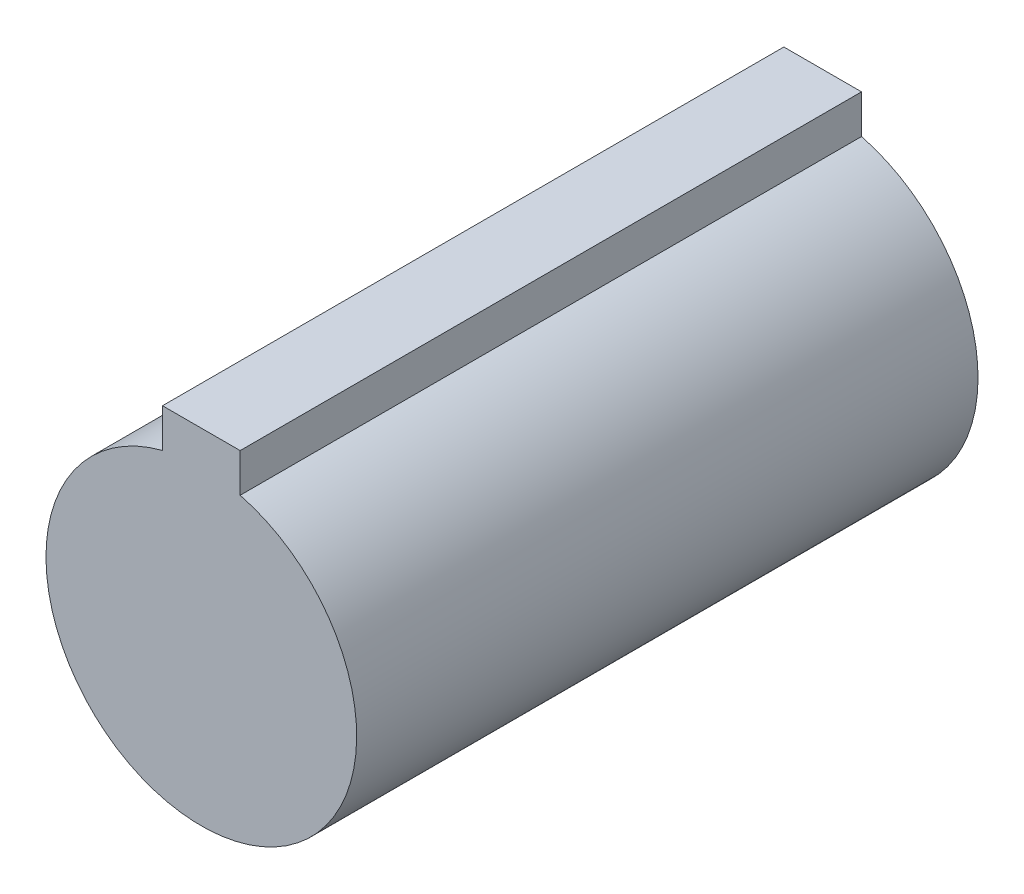
ISO-10303-21;
HEADER;
FILE_DESCRIPTION(('STEP AP214'),'2;1');
FILE_NAME('part.step','',(''),(''),'','','');
FILE_SCHEMA(('AUTOMOTIVE_DESIGN { 1 0 10303 214 1 1 1 1 }'));
ENDSEC;
DATA;
#1=APPLICATION_CONTEXT('core data for automotive mechanical design processes');
#2=APPLICATION_PROTOCOL_DEFINITION('international standard','automotive_design',2000,#1);
#3=PRODUCT_CONTEXT('',#1,'mechanical');
#4=PRODUCT('Part','Part','',(#3));
#5=PRODUCT_RELATED_PRODUCT_CATEGORY('part','',(#4));
#6=PRODUCT_DEFINITION_FORMATION('','',#4);
#7=PRODUCT_DEFINITION_CONTEXT('part definition',#1,'design');
#8=PRODUCT_DEFINITION('design','',#6,#7);
#9=PRODUCT_DEFINITION_SHAPE('','',#8);
#10=(LENGTH_UNIT() NAMED_UNIT(*) SI_UNIT(.MILLI.,.METRE.));
#11=(NAMED_UNIT(*) PLANE_ANGLE_UNIT() SI_UNIT($,.RADIAN.));
#12=(NAMED_UNIT(*) SI_UNIT($,.STERADIAN.) SOLID_ANGLE_UNIT());
#13=UNCERTAINTY_MEASURE_WITH_UNIT(LENGTH_MEASURE(1.E-05),#10,'distance_accuracy_value','');
#14=(GEOMETRIC_REPRESENTATION_CONTEXT(3) GLOBAL_UNCERTAINTY_ASSIGNED_CONTEXT((#13)) GLOBAL_UNIT_ASSIGNED_CONTEXT((#10,
#11,#12)) REPRESENTATION_CONTEXT('',''));
#15=CARTESIAN_POINT('',(0.,0.,0.));
#16=DIRECTION('',(0.,0.,1.));
#17=DIRECTION('',(1.,0.,0.));
#18=AXIS2_PLACEMENT_3D('',#15,#16,#17);
#19=CARTESIAN_POINT('',(-1.80595046373357,2.53165746535202,50.8));
#20=DIRECTION('',(0.,0.,-1.));
#21=DIRECTION('',(-1.,0.,0.));
#22=AXIS2_PLACEMENT_3D('',#19,#20,#21);
#23=CYLINDRICAL_SURFACE('',#22,6.35);
#24=CARTESIAN_POINT('',(-1.80595046373357,2.53165746535202,25.4));
#25=DIRECTION('',(0.,0.,1.));
#26=DIRECTION('',(1.,0.,0.));
#27=AXIS2_PLACEMENT_3D('',#24,#25,#26);
#28=CIRCLE('',#27,6.35);
#29=CARTESIAN_POINT('',(-3.39345046373357,8.68001852745629,25.4));
#30=VERTEX_POINT('',#29);
#31=CARTESIAN_POINT('',(-0.218450463733567,8.68001852745629,25.4));
#32=VERTEX_POINT('',#31);
#33=EDGE_CURVE('E110',#30,#32,#28,.T.);
#34=ORIENTED_EDGE('',*,*,#33,.T.);
#35=DIRECTION('',(0.,0.,-1.));
#36=VECTOR('',#35,1.);
#37=CARTESIAN_POINT('',(-0.218450463733567,8.68001852745629,50.8));
#38=LINE('',#37,#36);
#39=CARTESIAN_POINT('',(-0.218450463733567,8.68001852745629,50.8));
#40=VERTEX_POINT('',#39);
#41=EDGE_CURVE('E70',#40,#32,#38,.T.);
#42=ORIENTED_EDGE('',*,*,#41,.F.);
#43=CARTESIAN_POINT('',(-1.80595046373357,2.53165746535202,50.8));
#44=DIRECTION('',(0.,0.,1.));
#45=DIRECTION('',(1.,0.,0.));
#46=AXIS2_PLACEMENT_3D('',#43,#44,#45);
#47=CIRCLE('',#46,6.35);
#48=CARTESIAN_POINT('',(-3.39345046373357,8.68001852745629,50.8));
#49=VERTEX_POINT('',#48);
#50=EDGE_CURVE('E127',#49,#40,#47,.T.);
#51=ORIENTED_EDGE('',*,*,#50,.F.);
#52=DIRECTION('',(0.,0.,-1.));
#53=VECTOR('',#52,1.);
#54=CARTESIAN_POINT('',(-3.39345046373357,8.68001852745629,50.8));
#55=LINE('',#54,#53);
#56=EDGE_CURVE('E12',#49,#30,#55,.T.);
#57=ORIENTED_EDGE('',*,*,#56,.T.);
#58=EDGE_LOOP('',(#34,#42,#51,#57));
#59=FACE_BOUND('',#58,.T.);
#60=ADVANCED_FACE('F60',(#59),#23,.T.);
#61=CARTESIAN_POINT('',(0.,0.,25.4));
#62=DIRECTION('',(0.,0.,1.));
#63=DIRECTION('',(1.,0.,0.));
#64=AXIS2_PLACEMENT_3D('',#61,#62,#63);
#65=PLANE('',#64);
#66=ORIENTED_EDGE('',*,*,#33,.F.);
#67=DIRECTION('',(0.,-1.,0.));
#68=VECTOR('',#67,1.);
#69=CARTESIAN_POINT('',(-3.39345046373357,10.2631935622144,25.4));
#70=LINE('',#69,#68);
#71=CARTESIAN_POINT('',(-3.39345046373357,10.2631935622144,25.4));
#72=VERTEX_POINT('',#71);
#73=EDGE_CURVE('E105',#72,#30,#70,.T.);
#74=ORIENTED_EDGE('',*,*,#73,.F.);
#75=DIRECTION('',(1.,0.,0.));
#76=VECTOR('',#75,1.);
#77=CARTESIAN_POINT('',(-3.39345046373357,10.2631935622144,25.4));
#78=LINE('',#77,#76);
#79=CARTESIAN_POINT('',(-0.218450463733567,10.2631935622144,25.4));
#80=VERTEX_POINT('',#79);
#81=EDGE_CURVE('E115',#72,#80,#78,.T.);
#82=ORIENTED_EDGE('',*,*,#81,.T.);
#83=DIRECTION('',(0.,-1.,0.));
#84=VECTOR('',#83,1.);
#85=CARTESIAN_POINT('',(-0.218450463733567,10.2631935622144,25.4));
#86=LINE('',#85,#84);
#87=EDGE_CURVE('E117',#80,#32,#86,.T.);
#88=ORIENTED_EDGE('',*,*,#87,.T.);
#89=EDGE_LOOP('',(#66,#74,#82,#88));
#90=FACE_BOUND('',#89,.T.);
#91=ADVANCED_FACE('F113',(#90),#65,.F.);
#92=CARTESIAN_POINT('',(0.,0.,50.8));
#93=DIRECTION('',(0.,0.,1.));
#94=DIRECTION('',(1.,0.,0.));
#95=AXIS2_PLACEMENT_3D('',#92,#93,#94);
#96=PLANE('',#95);
#97=DIRECTION('',(0.,-1.,0.));
#98=VECTOR('',#97,1.);
#99=CARTESIAN_POINT('',(-3.39345046373357,10.2631935622144,50.8));
#100=LINE('',#99,#98);
#101=CARTESIAN_POINT('',(-3.39345046373357,10.2631935622144,50.8));
#102=VERTEX_POINT('',#101);
#103=EDGE_CURVE('E108',#102,#49,#100,.T.);
#104=ORIENTED_EDGE('',*,*,#103,.T.);
#105=ORIENTED_EDGE('',*,*,#50,.T.);
#106=DIRECTION('',(0.,-1.,0.));
#107=VECTOR('',#106,1.);
#108=CARTESIAN_POINT('',(-0.218450463733567,10.2631935622144,50.8));
#109=LINE('',#108,#107);
#110=CARTESIAN_POINT('',(-0.218450463733567,10.2631935622144,50.8));
#111=VERTEX_POINT('',#110);
#112=EDGE_CURVE('E123',#111,#40,#109,.T.);
#113=ORIENTED_EDGE('',*,*,#112,.F.);
#114=DIRECTION('',(1.,0.,0.));
#115=VECTOR('',#114,1.);
#116=CARTESIAN_POINT('',(-3.39345046373357,10.2631935622144,50.8));
#117=LINE('',#116,#115);
#118=EDGE_CURVE('E116',#102,#111,#117,.T.);
#119=ORIENTED_EDGE('',*,*,#118,.F.);
#120=EDGE_LOOP('',(#104,#105,#113,#119));
#121=FACE_BOUND('',#120,.T.);
#122=ADVANCED_FACE('F132',(#121),#96,.T.);
#123=CARTESIAN_POINT('',(-3.39345046373357,10.2631935622144,50.8));
#124=DIRECTION('',(1.,0.,0.));
#125=DIRECTION('',(0.,0.,-1.));
#126=AXIS2_PLACEMENT_3D('',#123,#124,#125);
#127=PLANE('',#126);
#128=ORIENTED_EDGE('',*,*,#73,.T.);
#129=ORIENTED_EDGE('',*,*,#56,.F.);
#130=ORIENTED_EDGE('',*,*,#103,.F.);
#131=DIRECTION('',(0.,0.,-1.));
#132=VECTOR('',#131,1.);
#133=CARTESIAN_POINT('',(-3.39345046373357,10.2631935622144,50.8));
#134=LINE('',#133,#132);
#135=EDGE_CURVE('E102',#102,#72,#134,.T.);
#136=ORIENTED_EDGE('',*,*,#135,.T.);
#137=EDGE_LOOP('',(#128,#129,#130,#136));
#138=FACE_BOUND('',#137,.T.);
#139=ADVANCED_FACE('F104',(#138),#127,.F.);
#140=CARTESIAN_POINT('',(-0.218450463733567,10.2631935622144,50.8));
#141=DIRECTION('',(1.,0.,0.));
#142=DIRECTION('',(0.,0.,-1.));
#143=AXIS2_PLACEMENT_3D('',#140,#141,#142);
#144=PLANE('',#143);
#145=ORIENTED_EDGE('',*,*,#41,.T.);
#146=ORIENTED_EDGE('',*,*,#87,.F.);
#147=DIRECTION('',(0.,0.,-1.));
#148=VECTOR('',#147,1.);
#149=CARTESIAN_POINT('',(-0.218450463733567,10.2631935622144,50.8));
#150=LINE('',#149,#148);
#151=EDGE_CURVE('E64',#111,#80,#150,.T.);
#152=ORIENTED_EDGE('',*,*,#151,.F.);
#153=ORIENTED_EDGE('',*,*,#112,.T.);
#154=EDGE_LOOP('',(#145,#146,#152,#153));
#155=FACE_BOUND('',#154,.T.);
#156=ADVANCED_FACE('F141',(#155),#144,.T.);
#157=CARTESIAN_POINT('',(-3.39345046373357,10.2631935622144,50.8));
#158=DIRECTION('',(0.,1.,0.));
#159=DIRECTION('',(0.,0.,1.));
#160=AXIS2_PLACEMENT_3D('',#157,#158,#159);
#161=PLANE('',#160);
#162=ORIENTED_EDGE('',*,*,#81,.F.);
#163=ORIENTED_EDGE('',*,*,#135,.F.);
#164=ORIENTED_EDGE('',*,*,#118,.T.);
#165=ORIENTED_EDGE('',*,*,#151,.T.);
#166=EDGE_LOOP('',(#162,#163,#164,#165));
#167=FACE_BOUND('',#166,.T.);
#168=ADVANCED_FACE('F62',(#167),#161,.T.);
#169=CLOSED_SHELL('',(#60,#91,#122,#139,#156,#168));
#170=MANIFOLD_SOLID_BREP('B2',#169);
#171=ADVANCED_BREP_SHAPE_REPRESENTATION('',(#18,#170),#14);
#172=SHAPE_DEFINITION_REPRESENTATION(#9,#171);
ENDSEC;
END-ISO-10303-21;
